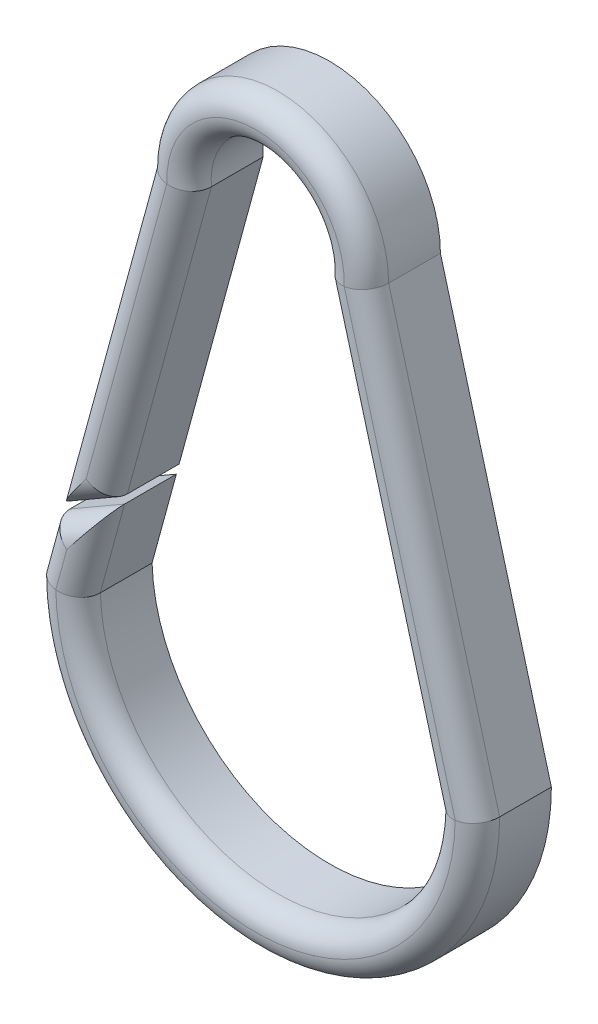
ISO-10303-21;
HEADER;
FILE_DESCRIPTION(('STEP AP214'),'2;1');
FILE_NAME('part.step','',(''),(''),'','','');
FILE_SCHEMA(('AUTOMOTIVE_DESIGN { 1 0 10303 214 1 1 1 1 }'));
ENDSEC;
DATA;
#1=APPLICATION_CONTEXT('core data for automotive mechanical design processes');
#2=APPLICATION_PROTOCOL_DEFINITION('international standard','automotive_design',2000,#1);
#3=PRODUCT_CONTEXT('',#1,'mechanical');
#4=PRODUCT('Part','Part','',(#3));
#5=PRODUCT_RELATED_PRODUCT_CATEGORY('part','',(#4));
#6=PRODUCT_DEFINITION_FORMATION('','',#4);
#7=PRODUCT_DEFINITION_CONTEXT('part definition',#1,'design');
#8=PRODUCT_DEFINITION('design','',#6,#7);
#9=PRODUCT_DEFINITION_SHAPE('','',#8);
#10=(LENGTH_UNIT() NAMED_UNIT(*) SI_UNIT(.MILLI.,.METRE.));
#11=(NAMED_UNIT(*) PLANE_ANGLE_UNIT() SI_UNIT($,.RADIAN.));
#12=(NAMED_UNIT(*) SI_UNIT($,.STERADIAN.) SOLID_ANGLE_UNIT());
#13=UNCERTAINTY_MEASURE_WITH_UNIT(LENGTH_MEASURE(1.E-05),#10,'distance_accuracy_value','');
#14=(GEOMETRIC_REPRESENTATION_CONTEXT(3) GLOBAL_UNCERTAINTY_ASSIGNED_CONTEXT((#13)) GLOBAL_UNIT_ASSIGNED_CONTEXT((#10,
#11,#12)) REPRESENTATION_CONTEXT('',''));
#15=CARTESIAN_POINT('',(0.,0.,0.));
#16=DIRECTION('',(0.,0.,1.));
#17=DIRECTION('',(1.,0.,0.));
#18=AXIS2_PLACEMENT_3D('',#15,#16,#17);
#19=CARTESIAN_POINT('',(0.0449745055544494,13.0306130568705,1.17399375005412));
#20=DIRECTION('',(0.,0.,1.));
#21=DIRECTION('',(1.,0.,0.));
#22=AXIS2_PLACEMENT_3D('',#19,#20,#21);
#23=PLANE('',#22);
#24=DIRECTION('',(-0.866025403784438,-0.500000000000001,0.));
#25=VECTOR('',#24,1.);
#26=CARTESIAN_POINT('',(-4.08002549444555,2.99711940781657,1.17399375005412));
#27=LINE('',#26,#25);
#28=CARTESIAN_POINT('',(-5.03739474479932,2.44438201341095,1.17399375005412));
#29=VERTEX_POINT('',#28);
#30=CARTESIAN_POINT('',(-6.88274704673623,1.37896736513798,1.17399375005412));
#31=VERTEX_POINT('',#30);
#32=EDGE_CURVE('E406',#29,#31,#27,.T.);
#33=ORIENTED_EDGE('',*,*,#32,.T.);
#34=DIRECTION('',(-0.263117405792109,-0.964763821237732,0.));
#35=VECTOR('',#34,1.);
#36=CARTESIAN_POINT('',(-3.70502549444555,13.0306130568705,1.17399375005412));
#37=LINE('',#36,#35);
#38=CARTESIAN_POINT('',(-3.70502549444555,13.0306130568705,1.17399375005412));
#39=VERTEX_POINT('',#38);
#40=EDGE_CURVE('E374',#39,#31,#37,.T.);
#41=ORIENTED_EDGE('',*,*,#40,.F.);
#42=CARTESIAN_POINT('',(0.0449745055544494,13.0306130568705,1.17399375005412));
#43=DIRECTION('',(0.,0.,1.));
#44=DIRECTION('',(1.,0.,0.));
#45=AXIS2_PLACEMENT_3D('',#42,#43,#44);
#46=CIRCLE('',#45,3.75);
#47=CARTESIAN_POINT('',(3.79497450555445,13.0306130568705,1.17399375005412));
#48=VERTEX_POINT('',#47);
#49=EDGE_CURVE('E174',#48,#39,#46,.T.);
#50=ORIENTED_EDGE('',*,*,#49,.F.);
#51=DIRECTION('',(-0.263117405792109,0.964763821237732,0.));
#52=VECTOR('',#51,1.);
#53=CARTESIAN_POINT('',(3.79497450555445,13.0306130568705,1.17399375005412));
#54=LINE('',#53,#52);
#55=CARTESIAN_POINT('',(7.54497450555445,-0.719386943129537,1.17399375005412));
#56=VERTEX_POINT('',#55);
#57=EDGE_CURVE('E380',#56,#48,#54,.T.);
#58=ORIENTED_EDGE('',*,*,#57,.F.);
#59=CARTESIAN_POINT('',(0.0449745055544511,-0.719386943129537,1.17399375005412));
#60=DIRECTION('',(0.,0.,1.));
#61=DIRECTION('',(1.,0.,0.));
#62=AXIS2_PLACEMENT_3D('',#59,#60,#61);
#63=CIRCLE('',#62,7.5);
#64=CARTESIAN_POINT('',(-7.45502549444555,-0.719386943129538,1.17399375005412));
#65=VERTEX_POINT('',#64);
#66=EDGE_CURVE('E377',#65,#56,#63,.T.);
#67=ORIENTED_EDGE('',*,*,#66,.F.);
#68=CARTESIAN_POINT('',(-6.97619009285173,1.03634286271448,1.17399375005412));
#69=VERTEX_POINT('',#68);
#70=EDGE_CURVE('E373',#69,#65,#37,.T.);
#71=ORIENTED_EDGE('',*,*,#70,.F.);
#72=DIRECTION('',(0.866025403784438,0.500000000000001,0.));
#73=VECTOR('',#72,1.);
#74=CARTESIAN_POINT('',(-3.95502549444555,2.78061305687046,1.17399375005412));
#75=LINE('',#74,#73);
#76=CARTESIAN_POINT('',(-5.13083779091482,2.10175751098745,1.17399375005412));
#77=VERTEX_POINT('',#76);
#78=EDGE_CURVE('E92',#69,#77,#75,.T.);
#79=ORIENTED_EDGE('',*,*,#78,.T.);
#80=DIRECTION('',(-0.263117405792109,-0.964763821237732,0.));
#81=VECTOR('',#80,1.);
#82=CARTESIAN_POINT('',(-2.19815581256686,12.85492476493,1.17399375005412));
#83=LINE('',#82,#81);
#84=CARTESIAN_POINT('',(-5.95202083875399,-0.909246997756191,1.17399375005412));
#85=VERTEX_POINT('',#84);
#86=EDGE_CURVE('E574',#77,#85,#83,.T.);
#87=ORIENTED_EDGE('',*,*,#86,.T.);
#88=CARTESIAN_POINT('',(0.0449745055544511,-0.719386943129537,1.17399375005412));
#89=DIRECTION('',(0.,0.,1.));
#90=DIRECTION('',(1.,0.,0.));
#91=AXIS2_PLACEMENT_3D('',#88,#89,#90);
#92=CIRCLE('',#91,6.);
#93=CARTESIAN_POINT('',(6.0419698498629,-0.909246997756193,1.17399375005412));
#94=VERTEX_POINT('',#93);
#95=EDGE_CURVE('E576',#85,#94,#92,.T.);
#96=ORIENTED_EDGE('',*,*,#95,.T.);
#97=DIRECTION('',(-0.263117405792109,0.964763821237732,0.));
#98=VECTOR('',#97,1.);
#99=CARTESIAN_POINT('',(2.28810482367576,12.85492476493,1.17399375005412));
#100=LINE('',#99,#98);
#101=CARTESIAN_POINT('',(2.28810482367576,12.85492476493,1.17399375005412));
#102=VERTEX_POINT('',#101);
#103=EDGE_CURVE('E362',#94,#102,#100,.T.);
#104=ORIENTED_EDGE('',*,*,#103,.T.);
#105=CARTESIAN_POINT('',(0.0449745055544494,13.0306130568705,1.17399375005412));
#106=DIRECTION('',(0.,0.,1.));
#107=DIRECTION('',(1.,0.,0.));
#108=AXIS2_PLACEMENT_3D('',#105,#106,#107);
#109=CIRCLE('',#108,2.25);
#110=CARTESIAN_POINT('',(-2.19815581256686,12.85492476493,1.17399375005412));
#111=VERTEX_POINT('',#110);
#112=EDGE_CURVE('E572',#102,#111,#109,.T.);
#113=ORIENTED_EDGE('',*,*,#112,.T.);
#114=EDGE_CURVE('E172',#111,#29,#83,.T.);
#115=ORIENTED_EDGE('',*,*,#114,.T.);
#116=EDGE_LOOP('',(#33,#41,#50,#58,#67,#71,#79,#87,#96,#104,#113,#115));
#117=FACE_BOUND('',#116,.T.);
#118=ADVANCED_FACE('F37',(#117),#23,.F.);
#119=CARTESIAN_POINT('',(-3.70502549444555,13.0306130568705,3.67399375005412));
#120=DIRECTION('',(0.964763821237732,-0.263117405792109,0.));
#121=DIRECTION('',(0.263117405792109,0.964763821237732,0.));
#122=AXIS2_PLACEMENT_3D('',#119,#120,#121);
#123=PLANE('',#122);
#124=DIRECTION('',(0.,0.,-1.));
#125=VECTOR('',#124,1.);
#126=CARTESIAN_POINT('',(-6.88274704673623,1.37896736513798,3.67399375005412));
#127=LINE('',#126,#125);
#128=CARTESIAN_POINT('',(-6.88274704673623,1.37896736513798,2.92399375005412));
#129=VERTEX_POINT('',#128);
#130=EDGE_CURVE('E407',#129,#31,#127,.T.);
#131=ORIENTED_EDGE('',*,*,#130,.F.);
#132=DIRECTION('',(-0.263117405792109,-0.964763821237732,0.));
#133=VECTOR('',#132,1.);
#134=CARTESIAN_POINT('',(-3.70502549444555,13.0306130568705,2.92399375005412));
#135=LINE('',#134,#133);
#136=CARTESIAN_POINT('',(-3.70502549444555,13.0306130568705,2.92399375005412));
#137=VERTEX_POINT('',#136);
#138=EDGE_CURVE('E11',#129,#137,#135,.F.);
#139=ORIENTED_EDGE('',*,*,#138,.T.);
#140=DIRECTION('',(0.,0.,-1.));
#141=VECTOR('',#140,1.);
#142=CARTESIAN_POINT('',(-3.70502549444555,13.0306130568705,3.67399375005412));
#143=LINE('',#142,#141);
#144=EDGE_CURVE('E389',#137,#39,#143,.T.);
#145=ORIENTED_EDGE('',*,*,#144,.T.);
#146=ORIENTED_EDGE('',*,*,#40,.T.);
#147=EDGE_LOOP('',(#131,#139,#145,#146));
#148=FACE_BOUND('',#147,.T.);
#149=ADVANCED_FACE('F271',(#148),#123,.F.);
#150=DIRECTION('',(0.,0.,-1.));
#151=VECTOR('',#150,1.);
#152=CARTESIAN_POINT('',(-7.45502549444555,-0.719386943129538,3.67399375005412));
#153=LINE('',#152,#151);
#154=CARTESIAN_POINT('',(-7.45502549444555,-0.719386943129538,2.92399375005412));
#155=VERTEX_POINT('',#154);
#156=EDGE_CURVE('E387',#155,#65,#153,.T.);
#157=ORIENTED_EDGE('',*,*,#156,.F.);
#158=DIRECTION('',(-0.263117405792109,-0.964763821237732,0.));
#159=VECTOR('',#158,1.);
#160=CARTESIAN_POINT('',(-6.97619009285173,1.03634286271448,2.92399375005412));
#161=LINE('',#160,#159);
#162=CARTESIAN_POINT('',(-6.97619009285172,1.03634286271448,2.92399375005412));
#163=VERTEX_POINT('',#162);
#164=EDGE_CURVE('E342',#155,#163,#161,.F.);
#165=ORIENTED_EDGE('',*,*,#164,.T.);
#166=DIRECTION('',(0.,0.,1.));
#167=VECTOR('',#166,1.);
#168=CARTESIAN_POINT('',(-6.97619009285172,1.03634286271448,3.67399375005412));
#169=LINE('',#168,#167);
#170=EDGE_CURVE('E567',#69,#163,#169,.T.);
#171=ORIENTED_EDGE('',*,*,#170,.F.);
#172=ORIENTED_EDGE('',*,*,#70,.T.);
#173=EDGE_LOOP('',(#157,#165,#171,#172));
#174=FACE_BOUND('',#173,.T.);
#175=ADVANCED_FACE('F277',(#174),#123,.F.);
#176=CARTESIAN_POINT('',(-2.19815581256686,12.85492476493,3.67399375005412));
#177=DIRECTION('',(0.964763821237732,-0.263117405792109,0.));
#178=DIRECTION('',(0.263117405792109,0.964763821237732,0.));
#179=AXIS2_PLACEMENT_3D('',#176,#177,#178);
#180=PLANE('',#179);
#181=DIRECTION('',(0.,0.,-1.));
#182=VECTOR('',#181,1.);
#183=CARTESIAN_POINT('',(-2.19815581256686,12.85492476493,3.67399375005412));
#184=LINE('',#183,#182);
#185=CARTESIAN_POINT('',(-2.19815581256686,12.85492476493,2.92399375005412));
#186=VERTEX_POINT('',#185);
#187=EDGE_CURVE('E158',#186,#111,#184,.T.);
#188=ORIENTED_EDGE('',*,*,#187,.F.);
#189=DIRECTION('',(-0.263117405792109,-0.964763821237732,0.));
#190=VECTOR('',#189,1.);
#191=CARTESIAN_POINT('',(-2.19815581256686,12.85492476493,2.92399375005412));
#192=LINE('',#191,#190);
#193=CARTESIAN_POINT('',(-5.03739474479932,2.44438201341095,2.92399375005412));
#194=VERTEX_POINT('',#193);
#195=EDGE_CURVE('E165',#186,#194,#192,.T.);
#196=ORIENTED_EDGE('',*,*,#195,.T.);
#197=DIRECTION('',(0.,0.,-1.));
#198=VECTOR('',#197,1.);
#199=CARTESIAN_POINT('',(-5.03739474479932,2.44438201341095,3.67399375005412));
#200=LINE('',#199,#198);
#201=EDGE_CURVE('E394',#194,#29,#200,.T.);
#202=ORIENTED_EDGE('',*,*,#201,.T.);
#203=ORIENTED_EDGE('',*,*,#114,.F.);
#204=EDGE_LOOP('',(#188,#196,#202,#203));
#205=FACE_BOUND('',#204,.T.);
#206=ADVANCED_FACE('F170',(#205),#180,.T.);
#207=DIRECTION('',(0.,0.,1.));
#208=VECTOR('',#207,1.);
#209=CARTESIAN_POINT('',(-5.13083779091482,2.10175751098746,3.67399375005412));
#210=LINE('',#209,#208);
#211=CARTESIAN_POINT('',(-5.13083779091482,2.10175751098746,2.92399375005412));
#212=VERTEX_POINT('',#211);
#213=EDGE_CURVE('E391',#77,#212,#210,.T.);
#214=ORIENTED_EDGE('',*,*,#213,.T.);
#215=DIRECTION('',(-0.263117405792109,-0.964763821237732,0.));
#216=VECTOR('',#215,1.);
#217=CARTESIAN_POINT('',(-2.19815581256686,12.85492476493,2.92399375005412));
#218=LINE('',#217,#216);
#219=CARTESIAN_POINT('',(-5.95202083875399,-0.909246997756191,2.92399375005412));
#220=VERTEX_POINT('',#219);
#221=EDGE_CURVE('E352',#212,#220,#218,.T.);
#222=ORIENTED_EDGE('',*,*,#221,.T.);
#223=DIRECTION('',(0.,0.,-1.));
#224=VECTOR('',#223,1.);
#225=CARTESIAN_POINT('',(-5.95202083875399,-0.909246997756191,3.67399375005412));
#226=LINE('',#225,#224);
#227=EDGE_CURVE('E175',#220,#85,#226,.T.);
#228=ORIENTED_EDGE('',*,*,#227,.T.);
#229=ORIENTED_EDGE('',*,*,#86,.F.);
#230=EDGE_LOOP('',(#214,#222,#228,#229));
#231=FACE_BOUND('',#230,.T.);
#232=ADVANCED_FACE('F295',(#231),#180,.T.);
#233=CARTESIAN_POINT('',(0.0449745055544494,13.0306130568705,3.67399375005412));
#234=DIRECTION('',(0.,0.,-1.));
#235=DIRECTION('',(-1.,0.,0.));
#236=AXIS2_PLACEMENT_3D('',#233,#234,#235);
#237=CYLINDRICAL_SURFACE('',#236,3.75);
#238=ORIENTED_EDGE('',*,*,#144,.F.);
#239=CARTESIAN_POINT('',(0.0449745055544494,13.0306130568705,2.92399375005412));
#240=DIRECTION('',(0.,0.,1.));
#241=DIRECTION('',(1.,0.,0.));
#242=AXIS2_PLACEMENT_3D('',#239,#240,#241);
#243=CIRCLE('',#242,3.75);
#244=CARTESIAN_POINT('',(3.79497450555445,13.0306130568705,2.92399375005412));
#245=VERTEX_POINT('',#244);
#246=EDGE_CURVE('E347',#137,#245,#243,.F.);
#247=ORIENTED_EDGE('',*,*,#246,.T.);
#248=DIRECTION('',(0.,0.,-1.));
#249=VECTOR('',#248,1.);
#250=CARTESIAN_POINT('',(3.79497450555445,13.0306130568705,3.67399375005412));
#251=LINE('',#250,#249);
#252=EDGE_CURVE('E383',#245,#48,#251,.T.);
#253=ORIENTED_EDGE('',*,*,#252,.T.);
#254=ORIENTED_EDGE('',*,*,#49,.T.);
#255=EDGE_LOOP('',(#238,#247,#253,#254));
#256=FACE_BOUND('',#255,.T.);
#257=ADVANCED_FACE('F290',(#256),#237,.T.);
#258=CARTESIAN_POINT('',(0.0449745055544511,-0.719386943129537,3.67399375005412));
#259=DIRECTION('',(0.,0.,-1.));
#260=DIRECTION('',(-1.,0.,0.));
#261=AXIS2_PLACEMENT_3D('',#258,#259,#260);
#262=CYLINDRICAL_SURFACE('',#261,7.5);
#263=DIRECTION('',(0.,0.,-1.));
#264=VECTOR('',#263,1.);
#265=CARTESIAN_POINT('',(7.54497450555445,-0.719386943129537,3.67399375005412));
#266=LINE('',#265,#264);
#267=CARTESIAN_POINT('',(7.54497450555445,-0.719386943129537,2.92399375005412));
#268=VERTEX_POINT('',#267);
#269=EDGE_CURVE('E385',#268,#56,#266,.T.);
#270=ORIENTED_EDGE('',*,*,#269,.F.);
#271=CARTESIAN_POINT('',(0.0449745055544511,-0.719386943129537,2.92399375005412));
#272=DIRECTION('',(0.,0.,1.));
#273=DIRECTION('',(1.,0.,0.));
#274=AXIS2_PLACEMENT_3D('',#271,#272,#273);
#275=CIRCLE('',#274,7.5);
#276=EDGE_CURVE('E338',#268,#155,#275,.F.);
#277=ORIENTED_EDGE('',*,*,#276,.T.);
#278=ORIENTED_EDGE('',*,*,#156,.T.);
#279=ORIENTED_EDGE('',*,*,#66,.T.);
#280=EDGE_LOOP('',(#270,#277,#278,#279));
#281=FACE_BOUND('',#280,.T.);
#282=ADVANCED_FACE('F287',(#281),#262,.T.);
#283=CARTESIAN_POINT('',(3.79497450555445,13.0306130568705,3.67399375005412));
#284=DIRECTION('',(-0.964763821237732,-0.263117405792109,0.));
#285=DIRECTION('',(0.263117405792109,-0.964763821237732,0.));
#286=AXIS2_PLACEMENT_3D('',#283,#284,#285);
#287=PLANE('',#286);
#288=ORIENTED_EDGE('',*,*,#252,.F.);
#289=DIRECTION('',(-0.263117405792109,0.964763821237732,0.));
#290=VECTOR('',#289,1.);
#291=CARTESIAN_POINT('',(7.54497450555445,-0.719386943129537,2.92399375005412));
#292=LINE('',#291,#290);
#293=EDGE_CURVE('E343',#245,#268,#292,.F.);
#294=ORIENTED_EDGE('',*,*,#293,.T.);
#295=ORIENTED_EDGE('',*,*,#269,.T.);
#296=ORIENTED_EDGE('',*,*,#57,.T.);
#297=EDGE_LOOP('',(#288,#294,#295,#296));
#298=FACE_BOUND('',#297,.T.);
#299=ADVANCED_FACE('F284',(#298),#287,.F.);
#300=CARTESIAN_POINT('',(0.0449745055544494,13.0306130568705,3.67399375005412));
#301=DIRECTION('',(0.,0.,-1.));
#302=DIRECTION('',(-1.,0.,0.));
#303=AXIS2_PLACEMENT_3D('',#300,#301,#302);
#304=CYLINDRICAL_SURFACE('',#303,2.25);
#305=DIRECTION('',(0.,0.,-1.));
#306=VECTOR('',#305,1.);
#307=CARTESIAN_POINT('',(2.28810482367576,12.85492476493,3.67399375005412));
#308=LINE('',#307,#306);
#309=CARTESIAN_POINT('',(2.28810482367576,12.85492476493,2.92399375005412));
#310=VERTEX_POINT('',#309);
#311=EDGE_CURVE('E160',#310,#102,#308,.T.);
#312=ORIENTED_EDGE('',*,*,#311,.F.);
#313=CARTESIAN_POINT('',(0.0449745055544494,13.0306130568705,2.92399375005412));
#314=DIRECTION('',(0.,0.,1.));
#315=DIRECTION('',(1.,0.,0.));
#316=AXIS2_PLACEMENT_3D('',#313,#314,#315);
#317=CIRCLE('',#316,2.25);
#318=EDGE_CURVE('E154',#310,#186,#317,.T.);
#319=ORIENTED_EDGE('',*,*,#318,.T.);
#320=ORIENTED_EDGE('',*,*,#187,.T.);
#321=ORIENTED_EDGE('',*,*,#112,.F.);
#322=EDGE_LOOP('',(#312,#319,#320,#321));
#323=FACE_BOUND('',#322,.T.);
#324=ADVANCED_FACE('F156',(#323),#304,.F.);
#325=CARTESIAN_POINT('',(0.0449745055544511,-0.719386943129537,3.67399375005412));
#326=DIRECTION('',(0.,0.,-1.));
#327=DIRECTION('',(-1.,0.,0.));
#328=AXIS2_PLACEMENT_3D('',#325,#326,#327);
#329=CYLINDRICAL_SURFACE('',#328,6.);
#330=ORIENTED_EDGE('',*,*,#227,.F.);
#331=CARTESIAN_POINT('',(0.0449745055544511,-0.719386943129537,2.92399375005412));
#332=DIRECTION('',(0.,0.,1.));
#333=DIRECTION('',(1.,0.,0.));
#334=AXIS2_PLACEMENT_3D('',#331,#332,#333);
#335=CIRCLE('',#334,6.);
#336=CARTESIAN_POINT('',(6.0419698498629,-0.909246997756193,2.92399375005412));
#337=VERTEX_POINT('',#336);
#338=EDGE_CURVE('E354',#220,#337,#335,.T.);
#339=ORIENTED_EDGE('',*,*,#338,.T.);
#340=DIRECTION('',(0.,0.,-1.));
#341=VECTOR('',#340,1.);
#342=CARTESIAN_POINT('',(6.0419698498629,-0.909246997756193,3.67399375005412));
#343=LINE('',#342,#341);
#344=EDGE_CURVE('E360',#337,#94,#343,.T.);
#345=ORIENTED_EDGE('',*,*,#344,.T.);
#346=ORIENTED_EDGE('',*,*,#95,.F.);
#347=EDGE_LOOP('',(#330,#339,#345,#346));
#348=FACE_BOUND('',#347,.T.);
#349=ADVANCED_FACE('F491',(#348),#329,.F.);
#350=CARTESIAN_POINT('',(2.28810482367576,12.85492476493,3.67399375005412));
#351=DIRECTION('',(-0.964763821237732,-0.263117405792109,0.));
#352=DIRECTION('',(0.263117405792109,-0.964763821237732,0.));
#353=AXIS2_PLACEMENT_3D('',#350,#351,#352);
#354=PLANE('',#353);
#355=ORIENTED_EDGE('',*,*,#344,.F.);
#356=DIRECTION('',(-0.263117405792109,0.964763821237732,0.));
#357=VECTOR('',#356,1.);
#358=CARTESIAN_POINT('',(2.28810482367576,12.85492476493,2.92399375005412));
#359=LINE('',#358,#357);
#360=EDGE_CURVE('E166',#337,#310,#359,.T.);
#361=ORIENTED_EDGE('',*,*,#360,.T.);
#362=ORIENTED_EDGE('',*,*,#311,.T.);
#363=ORIENTED_EDGE('',*,*,#103,.F.);
#364=EDGE_LOOP('',(#355,#361,#362,#363));
#365=FACE_BOUND('',#364,.T.);
#366=ADVANCED_FACE('F358',(#365),#354,.T.);
#367=CARTESIAN_POINT('',(-3.95502549444555,2.78061305687046,3.67399375005412));
#368=DIRECTION('',(-0.500000000000001,0.866025403784438,0.));
#369=DIRECTION('',(-0.866025403784438,-0.500000000000001,0.));
#370=AXIS2_PLACEMENT_3D('',#367,#368,#369);
#371=PLANE('',#370);
#372=ORIENTED_EDGE('',*,*,#170,.T.);
#373=DIRECTION('',(0.866025403784438,0.500000000000001,0.));
#374=VECTOR('',#373,1.);
#375=CARTESIAN_POINT('',(-3.95502549444555,2.78061305687046,2.92399375005412));
#376=LINE('',#375,#374);
#377=EDGE_CURVE('E345',#163,#212,#376,.T.);
#378=ORIENTED_EDGE('',*,*,#377,.T.);
#379=ORIENTED_EDGE('',*,*,#213,.F.);
#380=ORIENTED_EDGE('',*,*,#78,.F.);
#381=EDGE_LOOP('',(#372,#378,#379,#380));
#382=FACE_BOUND('',#381,.T.);
#383=ADVANCED_FACE('F473',(#382),#371,.T.);
#384=CARTESIAN_POINT('',(-4.08002549444555,2.99711940781657,3.67399375005412));
#385=DIRECTION('',(0.500000000000001,-0.866025403784438,0.));
#386=DIRECTION('',(0.866025403784438,0.500000000000001,0.));
#387=AXIS2_PLACEMENT_3D('',#384,#385,#386);
#388=PLANE('',#387);
#389=ORIENTED_EDGE('',*,*,#201,.F.);
#390=DIRECTION('',(-0.866025403784438,-0.500000000000001,0.));
#391=VECTOR('',#390,1.);
#392=CARTESIAN_POINT('',(-4.08002549444555,2.99711940781657,2.92399375005412));
#393=LINE('',#392,#391);
#394=EDGE_CURVE('E47',#194,#129,#393,.T.);
#395=ORIENTED_EDGE('',*,*,#394,.T.);
#396=ORIENTED_EDGE('',*,*,#130,.T.);
#397=ORIENTED_EDGE('',*,*,#32,.F.);
#398=EDGE_LOOP('',(#389,#395,#396,#397));
#399=FACE_BOUND('',#398,.T.);
#400=ADVANCED_FACE('F268',(#399),#388,.T.);
#401=CARTESIAN_POINT('',(-3.58002549444555,2.13109400403213,2.92399375005412));
#402=DIRECTION('',(0.866025403784438,0.500000000000001,0.));
#403=DIRECTION('',(-0.500000000000001,0.866025403784438,0.));
#404=AXIS2_PLACEMENT_3D('',#401,#402,#403);
#405=CYLINDRICAL_SURFACE('',#404,0.75);
#406=CARTESIAN_POINT('',(-6.33384308022977,0.541176679580487,2.92399375005412));
#407=DIRECTION('',(0.791996071020887,-0.610526185750848,0.));
#408=DIRECTION('',(-0.610526185750848,-0.791996071020887,0.));
#409=AXIS2_PLACEMENT_3D('',#406,#407,#408);
#410=ELLIPSE('',#409,1.97044011770838,0.75);
#411=CARTESIAN_POINT('',(-6.33384308022977,0.541176679580485,3.67399375005412));
#412=VERTEX_POINT('',#411);
#413=EDGE_CURVE('E41',#212,#412,#410,.T.);
#414=ORIENTED_EDGE('',*,*,#413,.F.);
#415=ORIENTED_EDGE('',*,*,#377,.F.);
#416=CARTESIAN_POINT('',(-6.33384308022977,0.541176679580486,2.92399375005412));
#417=DIRECTION('',(0.610526185750848,0.791996071020887,0.));
#418=DIRECTION('',(0.791996071020887,-0.610526185750848,0.));
#419=AXIS2_PLACEMENT_3D('',#416,#417,#418);
#420=ELLIPSE('',#419,0.811048231330201,0.75);
#421=EDGE_CURVE('E564',#412,#163,#420,.F.);
#422=ORIENTED_EDGE('',*,*,#421,.F.);
#423=EDGE_LOOP('',(#414,#415,#422));
#424=FACE_BOUND('',#423,.T.);
#425=ADVANCED_FACE('F39',(#424),#405,.T.);
#426=CARTESIAN_POINT('',(-2.92172867849516,13.052262819274,2.92399375005412));
#427=DIRECTION('',(-0.263117405792109,-0.964763821237732,0.));
#428=DIRECTION('',(0.964763821237732,-0.263117405792109,0.));
#429=AXIS2_PLACEMENT_3D('',#426,#427,#428);
#430=CYLINDRICAL_SURFACE('',#429,0.75);
#431=ORIENTED_EDGE('',*,*,#221,.F.);
#432=ORIENTED_EDGE('',*,*,#413,.T.);
#433=DIRECTION('',(-0.263117405792109,-0.964763821237732,0.));
#434=VECTOR('',#433,1.);
#435=CARTESIAN_POINT('',(-2.72183724390187,13.7851980794495,3.67399375005412));
#436=LINE('',#435,#434);
#437=CARTESIAN_POINT('',(-6.70431639228877,-0.817225464636649,3.67399375005412));
#438=VERTEX_POINT('',#437);
#439=EDGE_CURVE('E79',#438,#412,#436,.F.);
#440=ORIENTED_EDGE('',*,*,#439,.F.);
#441=CARTESIAN_POINT('',(-5.95202083875399,-0.909246997756191,2.92399375005412));
#442=CARTESIAN_POINT('',(-5.9519830972798,-0.909250525608945,2.96585428924864));
#443=CARTESIAN_POINT('',(-5.95553800367445,-0.908832515406309,3.00770119596999));
#444=CARTESIAN_POINT('',(-5.96955154002166,-0.907179745986317,3.0901630083232));
#445=CARTESIAN_POINT('',(-5.98000293547133,-0.905945842648211,3.13077915838586));
#446=CARTESIAN_POINT('',(-6.00753392543013,-0.902686925508698,3.20968151459674));
#447=CARTESIAN_POINT('',(-6.02461591268308,-0.900661626118949,3.24796687386954));
#448=CARTESIAN_POINT('',(-6.06488164160473,-0.895870003645837,3.32112074893146));
#449=CARTESIAN_POINT('',(-6.08806454978478,-0.893103781784054,3.35598973056307));
#450=CARTESIAN_POINT('',(-6.13998626914066,-0.886881052193322,3.4215261343208));
#451=CARTESIAN_POINT('',(-6.16875224521049,-0.883421166552616,3.45217170687668));
#452=CARTESIAN_POINT('',(-6.23094223890964,-0.875903630751185,3.50823374530939));
#453=CARTESIAN_POINT('',(-6.26436780358085,-0.871845782033567,3.53364846750953));
#454=CARTESIAN_POINT('',(-6.33529215130453,-0.863189218408831,3.57879904428131));
#455=CARTESIAN_POINT('',(-6.37283020737129,-0.858585246185789,3.59847211948851));
#456=CARTESIAN_POINT('',(-6.45061475493056,-0.848991285389381,3.63124163928745));
#457=CARTESIAN_POINT('',(-6.4908594499743,-0.84400155253028,3.64434239814213));
#458=CARTESIAN_POINT('',(-6.55895110943689,-0.835511812841434,3.66035781130407));
#459=CARTESIAN_POINT('',(-6.58636710716386,-0.832081337695731,3.66522077076219));
#460=CARTESIAN_POINT('',(-6.64153103983908,-0.825153873326359,3.6718838676268));
#461=CARTESIAN_POINT('',(-6.66927834087835,-0.821657005321561,3.67368912876935));
#462=CARTESIAN_POINT('',(-6.69945009193958,-0.817841189450489,3.67398198300345));
#463=CARTESIAN_POINT('',(-6.70188334285505,-0.817533361779162,3.67399378096689));
#464=CARTESIAN_POINT('',(-6.70431639228877,-0.817225464635882,3.67399375005412));
#465=B_SPLINE_CURVE_WITH_KNOTS('',3,(#441,#442,#443,#444,#445,#446,#447,#448,#449,#450,#451,
#452,#453,#454,#455,#456,#457,#458,#459,#460,#461,#462,#463,#464),.UNSPECIFIED.,.F.,.F.,(4,2,2,
2,2,2,2,2,2,2,2,4),(0.,0.125408778092763,0.250686209510829,0.376008891172538,0.501314460523631,
0.627245732861154,0.753218915985328,0.880521898322377,1.00774120551205,1.09175777816457,
1.17563342580017,1.18299131185041),.UNSPECIFIED.);
#466=EDGE_CURVE('E249',#220,#438,#465,.T.);
#467=ORIENTED_EDGE('',*,*,#466,.F.);
#468=EDGE_LOOP('',(#431,#432,#440,#467));
#469=FACE_BOUND('',#468,.T.);
#470=ADVANCED_FACE('F260',(#469),#430,.T.);
#471=CARTESIAN_POINT('',(-2.72183724390187,13.7851980794495,2.92399375005412));
#472=DIRECTION('',(0.263117405792109,0.964763821237732,0.));
#473=DIRECTION('',(-0.964763821237732,0.263117405792109,0.));
#474=AXIS2_PLACEMENT_3D('',#471,#472,#473);
#475=CYLINDRICAL_SURFACE('',#474,0.75);
#476=ORIENTED_EDGE('',*,*,#421,.T.);
#477=ORIENTED_EDGE('',*,*,#164,.F.);
#478=CARTESIAN_POINT('',(-7.45502549444555,-0.719386943129538,2.92399375005412));
#479=CARTESIAN_POINT('',(-7.4550623974213,-0.719381323614066,2.96591171301624));
#480=CARTESIAN_POINT('',(-7.45151354226274,-0.71985724493192,3.00781686384974));
#481=CARTESIAN_POINT('',(-7.43751863448322,-0.721730436452894,3.09039832354614));
#482=CARTESIAN_POINT('',(-7.42707923862804,-0.723126817423009,3.13107577883024));
#483=CARTESIAN_POINT('',(-7.39957119711314,-0.726800064559524,3.21009951270098));
#484=CARTESIAN_POINT('',(-7.38249994779006,-0.729077276538353,3.24844486885953));
#485=CARTESIAN_POINT('',(-7.34224577753641,-0.734433842837376,3.32170843333515));
#486=CARTESIAN_POINT('',(-7.31906385539646,-0.737513066067702,3.35662720045004));
#487=CARTESIAN_POINT('',(-7.26715989970977,-0.744386332373706,3.42220325037839));
#488=CARTESIAN_POINT('',(-7.23841754130553,-0.748182996665434,3.45284416655047));
#489=CARTESIAN_POINT('',(-7.17626555649775,-0.756362856183783,3.50888238619596));
#490=CARTESIAN_POINT('',(-7.14285440802105,-0.760746242668111,3.53427797292066));
#491=CARTESIAN_POINT('',(-7.07201630244763,-0.770001132505002,3.57932769621879));
#492=CARTESIAN_POINT('',(-7.03455712249629,-0.774876528415442,3.59893029422799));
#493=CARTESIAN_POINT('',(-6.95693079125266,-0.784932643101101,3.63156433136764));
#494=CARTESIAN_POINT('',(-6.91676545940358,-0.790113156445771,3.64460013657904));
#495=CARTESIAN_POINT('',(-6.84890630559536,-0.798821902155313,3.66049351288116));
#496=CARTESIAN_POINT('',(-6.82164654429451,-0.802309102142645,3.66530743933594));
#497=CARTESIAN_POINT('',(-6.76679419534154,-0.809302332250159,3.67190346039471));
#498=CARTESIAN_POINT('',(-6.73920223780792,-0.812808321322663,3.67369059244712));
#499=CARTESIAN_POINT('',(-6.70918266984569,-0.816609555257206,3.67398198285648));
#500=CARTESIAN_POINT('',(-6.70674944237144,-0.816917568639661,3.67399378082284));
#501=CARTESIAN_POINT('',(-6.70431639228878,-0.817225464635887,3.67399375005412));
#502=B_SPLINE_CURVE_WITH_KNOTS('',3,(#478,#479,#480,#481,#482,#483,#484,#485,#486,#487,#488,
#489,#490,#491,#492,#493,#494,#495,#496,#497,#498,#499,#500,#501),.UNSPECIFIED.,.F.,.F.,(4,2,2,
2,2,2,2,2,2,2,2,4),(0.,0.125582480432083,0.251043816235328,0.376554457974871,0.502044597683502,
0.628002412756871,0.754001387582028,0.881089741020052,1.00809348499334,1.09164993687078,
1.17506718985335,1.18242507590724),.UNSPECIFIED.);
#503=EDGE_CURVE('E255',#438,#155,#502,.F.);
#504=ORIENTED_EDGE('',*,*,#503,.F.);
#505=ORIENTED_EDGE('',*,*,#439,.T.);
#506=EDGE_LOOP('',(#476,#477,#504,#505));
#507=FACE_BOUND('',#506,.T.);
#508=ADVANCED_FACE('F243',(#507),#475,.T.);
#509=CARTESIAN_POINT('',(0.0449745055544511,-0.719386943129537,2.92399375005412));
#510=DIRECTION('',(0.,0.,1.));
#511=DIRECTION('',(1.,0.,0.));
#512=AXIS2_PLACEMENT_3D('',#509,#510,#511);
#513=TOROIDAL_SURFACE('',#512,6.75,0.75);
#514=ORIENTED_EDGE('',*,*,#338,.F.);
#515=ORIENTED_EDGE('',*,*,#466,.T.);
#516=CARTESIAN_POINT('',(0.0449745055544511,-0.719386943129537,3.67399375005412));
#517=DIRECTION('',(0.,0.,1.));
#518=DIRECTION('',(1.,0.,0.));
#519=AXIS2_PLACEMENT_3D('',#516,#517,#518);
#520=CIRCLE('',#519,6.75);
#521=CARTESIAN_POINT('',(6.79426540339789,-0.817225464636651,3.67399375005412));
#522=VERTEX_POINT('',#521);
#523=EDGE_CURVE('E236',#522,#438,#520,.F.);
#524=ORIENTED_EDGE('',*,*,#523,.F.);
#525=CARTESIAN_POINT('',(6.0419698498629,-0.909246997756193,2.92399375005412));
#526=CARTESIAN_POINT('',(6.0419321083887,-0.909250525608947,2.96585428924864));
#527=CARTESIAN_POINT('',(6.04548701478335,-0.908832515406311,3.00770119596999));
#528=CARTESIAN_POINT('',(6.05950055113056,-0.907179745986319,3.0901630083232));
#529=CARTESIAN_POINT('',(6.06995194658023,-0.905945842648213,3.13077915838586));
#530=CARTESIAN_POINT('',(6.09748293653903,-0.902686925508698,3.20968151459674));
#531=CARTESIAN_POINT('',(6.11456492379198,-0.900661626118949,3.24796687386954));
#532=CARTESIAN_POINT('',(6.15483065271363,-0.895870003645836,3.32112074893146));
#533=CARTESIAN_POINT('',(6.17801356089368,-0.893103781784055,3.35598973056307));
#534=CARTESIAN_POINT('',(6.22993528024956,-0.886881052193323,3.4215261343208));
#535=CARTESIAN_POINT('',(6.25870125631939,-0.883421166552616,3.45217170687668));
#536=CARTESIAN_POINT('',(6.32089125001854,-0.875903630751186,3.50823374530939));
#537=CARTESIAN_POINT('',(6.35431681468975,-0.871845782033569,3.53364846750953));
#538=CARTESIAN_POINT('',(6.42524116241344,-0.863189218408835,3.57879904428131));
#539=CARTESIAN_POINT('',(6.46277921848019,-0.858585246185794,3.59847211948851));
#540=CARTESIAN_POINT('',(6.54056376603946,-0.848991285389379,3.63124163928745));
#541=CARTESIAN_POINT('',(6.5808084610832,-0.844001552530272,3.64434239814213));
#542=CARTESIAN_POINT('',(6.64890012054579,-0.835511812841439,3.66035781130407));
#543=CARTESIAN_POINT('',(6.67631611827277,-0.832081337695747,3.66522077076219));
#544=CARTESIAN_POINT('',(6.73148005094798,-0.825153873326342,3.6718838676268));
#545=CARTESIAN_POINT('',(6.75922735198725,-0.821657005321501,3.67368912876935));
#546=CARTESIAN_POINT('',(6.78939910304848,-0.817841189450477,3.67398198300345));
#547=CARTESIAN_POINT('',(6.79183235396396,-0.817533361779155,3.67399378096689));
#548=CARTESIAN_POINT('',(6.79426540339768,-0.817225464635881,3.67399375005412));
#549=B_SPLINE_CURVE_WITH_KNOTS('',3,(#525,#526,#527,#528,#529,#530,#531,#532,#533,#534,#535,
#536,#537,#538,#539,#540,#541,#542,#543,#544,#545,#546,#547,#548),.UNSPECIFIED.,.F.,.F.,(4,2,2,
2,2,2,2,2,2,2,2,4),(0.,0.125408778092762,0.250686209510829,0.376008891172537,0.50131446052363,
0.627245732861154,0.753218915985328,0.880521898322377,1.00774120551205,1.09175777816458,
1.17563342580018,1.18299131185042),.UNSPECIFIED.);
#550=EDGE_CURVE('E227',#337,#522,#549,.T.);
#551=ORIENTED_EDGE('',*,*,#550,.F.);
#552=EDGE_LOOP('',(#514,#515,#524,#551));
#553=FACE_BOUND('',#552,.T.);
#554=ADVANCED_FACE('F239',(#553),#513,.T.);
#555=CARTESIAN_POINT('',(0.0449745055544511,-0.719386943129537,2.92399375005412));
#556=DIRECTION('',(0.,0.,1.));
#557=DIRECTION('',(1.,0.,0.));
#558=AXIS2_PLACEMENT_3D('',#555,#556,#557);
#559=TOROIDAL_SURFACE('',#558,6.75,0.75);
#560=ORIENTED_EDGE('',*,*,#503,.T.);
#561=ORIENTED_EDGE('',*,*,#276,.F.);
#562=CARTESIAN_POINT('',(7.54497450555445,-0.719386943129537,2.92399375005412));
#563=CARTESIAN_POINT('',(7.5450114085302,-0.719381323614066,2.96591171301624));
#564=CARTESIAN_POINT('',(7.54146255337164,-0.71985724493192,3.00781686384974));
#565=CARTESIAN_POINT('',(7.52746764559212,-0.721730436452895,3.09039832354614));
#566=CARTESIAN_POINT('',(7.51702824973694,-0.723126817423009,3.13107577883024));
#567=CARTESIAN_POINT('',(7.48952020822204,-0.726800064559523,3.21009951270098));
#568=CARTESIAN_POINT('',(7.47244895889896,-0.729077276538351,3.24844486885953));
#569=CARTESIAN_POINT('',(7.43219478864531,-0.734433842837373,3.32170843333515));
#570=CARTESIAN_POINT('',(7.40901286650536,-0.7375130660677,3.35662720045004));
#571=CARTESIAN_POINT('',(7.35710891081867,-0.744386332373706,3.42220325037839));
#572=CARTESIAN_POINT('',(7.32836655241443,-0.748182996665435,3.45284416655047));
#573=CARTESIAN_POINT('',(7.26621456760666,-0.756362856183785,3.50888238619596));
#574=CARTESIAN_POINT('',(7.23280341912996,-0.760746242668112,3.53427797292066));
#575=CARTESIAN_POINT('',(7.16196531355653,-0.770001132505003,3.57932769621879));
#576=CARTESIAN_POINT('',(7.12450613360519,-0.774876528415442,3.59893029422799));
#577=CARTESIAN_POINT('',(7.04687980236156,-0.7849326431011,3.63156433136764));
#578=CARTESIAN_POINT('',(7.00671447051248,-0.790113156445769,3.64460013657904));
#579=CARTESIAN_POINT('',(6.93885531670427,-0.798821902155313,3.66049351288116));
#580=CARTESIAN_POINT('',(6.91159555540341,-0.802309102142646,3.66530743933594));
#581=CARTESIAN_POINT('',(6.85674320645044,-0.809302332250158,3.67190346039471));
#582=CARTESIAN_POINT('',(6.82915124891683,-0.81280832132266,3.67369059244712));
#583=CARTESIAN_POINT('',(6.7991316809546,-0.816609555257204,3.67398198285648));
#584=CARTESIAN_POINT('',(6.79669845348035,-0.816917568639659,3.67399378082284));
#585=CARTESIAN_POINT('',(6.79426540339769,-0.817225464635885,3.67399375005412));
#586=B_SPLINE_CURVE_WITH_KNOTS('',3,(#562,#563,#564,#565,#566,#567,#568,#569,#570,#571,#572,
#573,#574,#575,#576,#577,#578,#579,#580,#581,#582,#583,#584,#585),.UNSPECIFIED.,.F.,.F.,(4,2,2,
2,2,2,2,2,2,2,2,4),(0.,0.125582480432083,0.251043816235329,0.376554457974871,0.502044597683503,
0.628002412756872,0.754001387582029,0.881089741020053,1.00809348499334,1.09164993687077,
1.17506718985334,1.18242507590724),.UNSPECIFIED.);
#587=EDGE_CURVE('E321',#522,#268,#586,.F.);
#588=ORIENTED_EDGE('',*,*,#587,.F.);
#589=ORIENTED_EDGE('',*,*,#523,.T.);
#590=EDGE_LOOP('',(#560,#561,#588,#589));
#591=FACE_BOUND('',#590,.T.);
#592=ADVANCED_FACE('F221',(#591),#559,.T.);
#593=CARTESIAN_POINT('',(3.01167768960406,13.052262819274,2.92399375005412));
#594=DIRECTION('',(-0.263117405792109,0.964763821237732,0.));
#595=DIRECTION('',(-0.964763821237732,-0.263117405792109,0.));
#596=AXIS2_PLACEMENT_3D('',#593,#594,#595);
#597=CYLINDRICAL_SURFACE('',#596,0.75);
#598=ORIENTED_EDGE('',*,*,#360,.F.);
#599=ORIENTED_EDGE('',*,*,#550,.T.);
#600=DIRECTION('',(-0.263117405792109,0.964763821237732,0.));
#601=VECTOR('',#600,1.);
#602=CARTESIAN_POINT('',(2.81178625501077,13.7851980794495,3.67399375005412));
#603=LINE('',#602,#601);
#604=CARTESIAN_POINT('',(3.04347217770867,12.9356830295571,3.67399375005412));
#605=VERTEX_POINT('',#604);
#606=EDGE_CURVE('E193',#605,#522,#603,.F.);
#607=ORIENTED_EDGE('',*,*,#606,.F.);
#608=CARTESIAN_POINT('',(2.28810482367576,12.85492476493,2.92399375005412));
#609=CARTESIAN_POINT('',(2.28806592437598,12.8549238447532,2.96575634905024));
#610=CARTESIAN_POINT('',(2.29162737142593,12.855257032236,3.0075039850021));
#611=CARTESIAN_POINT('',(2.30565906941515,12.8565847917358,3.08976242310108));
#612=CARTESIAN_POINT('',(2.31612117434813,12.8575785839408,3.13027462471623));
#613=CARTESIAN_POINT('',(2.34366781534599,12.8602211582381,3.20897134017475));
#614=CARTESIAN_POINT('',(2.36075440020001,12.8618701429693,3.24715512966513));
#615=CARTESIAN_POINT('',(2.40101200271884,12.8658072518714,3.32012278756069));
#616=CARTESIAN_POINT('',(2.42418245139928,12.8680953162747,3.35490697349153));
#617=CARTESIAN_POINT('',(2.47610585507424,12.8733013550685,3.42036941985378));
#618=CARTESIAN_POINT('',(2.50489679640022,12.8762236317327,3.45101719582262));
#619=CARTESIAN_POINT('',(2.56712653964837,12.8826446984585,3.50710763529096));
#620=CARTESIAN_POINT('',(2.60056690253348,12.8861436822129,3.53254854355377));
#621=CARTESIAN_POINT('',(2.6716200149782,12.8937034378589,3.57785401907367));
#622=CARTESIAN_POINT('',(2.70928334798273,12.8977712063459,3.59763799620802));
#623=CARTESIAN_POINT('',(2.78732955937842,12.906341169657,3.63062686124592));
#624=CARTESIAN_POINT('',(2.82771071782139,12.9108430904988,3.6438358664292));
#625=CARTESIAN_POINT('',(2.8963269621874,12.9186127299529,3.66009344305669));
#626=CARTESIAN_POINT('',(2.92413543352303,12.9217930102981,3.66506009492329));
#627=CARTESIAN_POINT('',(2.98009112925558,12.9282550398275,3.67185874156538));
#628=CARTESIAN_POINT('',(3.00823769731651,12.9315366073005,3.67369605154687));
#629=CARTESIAN_POINT('',(3.03873915756337,12.9351254885662,3.67398267014492));
#630=CARTESIAN_POINT('',(3.04110577021258,12.9354041642954,3.67399377937567));
#631=CARTESIAN_POINT('',(3.04347217770867,12.9356830295571,3.67399375005412));
#632=B_SPLINE_CURVE_WITH_KNOTS('',3,(#608,#609,#610,#611,#612,#613,#614,#615,#616,#617,#618,
#619,#620,#621,#622,#623,#624,#625,#626,#627,#628,#629,#630,#631),.UNSPECIFIED.,.F.,.F.,(4,2,2,
2,2,2,2,2,2,2,2,4),(0.,0.12511265477459,0.250077881747967,0.375081788271065,0.500074008149951,
0.625942222852749,0.751852798135435,0.879476687927669,1.00702055815556,1.0921492047277,
1.17713311505571,1.1842819610569),.UNSPECIFIED.);
#633=EDGE_CURVE('E190',#310,#605,#632,.T.);
#634=ORIENTED_EDGE('',*,*,#633,.F.);
#635=EDGE_LOOP('',(#598,#599,#607,#634));
#636=FACE_BOUND('',#635,.T.);
#637=ADVANCED_FACE('F216',(#636),#597,.T.);
#638=CARTESIAN_POINT('',(-2.92172867849516,13.052262819274,2.92399375005412));
#639=DIRECTION('',(-0.263117405792109,-0.964763821237732,0.));
#640=DIRECTION('',(0.964763821237732,-0.263117405792109,0.));
#641=AXIS2_PLACEMENT_3D('',#638,#639,#640);
#642=CYLINDRICAL_SURFACE('',#641,0.75);
#643=CARTESIAN_POINT('',(-5.67974175742128,2.93954819654495,2.92399375005412));
#644=DIRECTION('',(-0.610526185750848,-0.791996071020887,0.));
#645=DIRECTION('',(-0.791996071020887,0.610526185750848,0.));
#646=AXIS2_PLACEMENT_3D('',#643,#644,#645);
#647=ELLIPSE('',#646,0.811048231330201,0.75);
#648=CARTESIAN_POINT('',(-5.67974175742128,2.93954819654495,3.67399375005412));
#649=VERTEX_POINT('',#648);
#650=EDGE_CURVE('E183',#194,#649,#647,.T.);
#651=ORIENTED_EDGE('',*,*,#650,.F.);
#652=ORIENTED_EDGE('',*,*,#195,.F.);
#653=CARTESIAN_POINT('',(-2.19815581256686,12.85492476493,2.92399375005412));
#654=CARTESIAN_POINT('',(-2.19811691326708,12.8549238447533,2.96575634905024));
#655=CARTESIAN_POINT('',(-2.20167836031703,12.855257032236,3.0075039850021));
#656=CARTESIAN_POINT('',(-2.21571005830625,12.8565847917358,3.08976242310108));
#657=CARTESIAN_POINT('',(-2.22617216323923,12.8575785839408,3.13027462471623));
#658=CARTESIAN_POINT('',(-2.25371880423709,12.8602211582381,3.20897134017475));
#659=CARTESIAN_POINT('',(-2.27080538909111,12.8618701429693,3.24715512966513));
#660=CARTESIAN_POINT('',(-2.31106299160994,12.8658072518714,3.32012278756069));
#661=CARTESIAN_POINT('',(-2.33423344029038,12.8680953162747,3.35490697349153));
#662=CARTESIAN_POINT('',(-2.38615684396535,12.8733013550685,3.42036941985378));
#663=CARTESIAN_POINT('',(-2.41494778529132,12.8762236317327,3.45101719582262));
#664=CARTESIAN_POINT('',(-2.47717752853947,12.8826446984585,3.50710763529096));
#665=CARTESIAN_POINT('',(-2.51061789142459,12.8861436822129,3.53254854355377));
#666=CARTESIAN_POINT('',(-2.5816710038693,12.8937034378589,3.57785401907367));
#667=CARTESIAN_POINT('',(-2.61933433687384,12.8977712063459,3.59763799620802));
#668=CARTESIAN_POINT('',(-2.69738054826952,12.906341169657,3.63062686124592));
#669=CARTESIAN_POINT('',(-2.73776170671249,12.9108430904988,3.6438358664292));
#670=CARTESIAN_POINT('',(-2.8063779510785,12.9186127299529,3.66009344305669));
#671=CARTESIAN_POINT('',(-2.83418642241414,12.921793010298,3.66506009492329));
#672=CARTESIAN_POINT('',(-2.89014211814668,12.9282550398275,3.67185874156538));
#673=CARTESIAN_POINT('',(-2.9182886862076,12.9315366073007,3.67369605154688));
#674=CARTESIAN_POINT('',(-2.94879014645447,12.9351254885662,3.67398267014492));
#675=CARTESIAN_POINT('',(-2.95115675910368,12.9354041642954,3.67399377937567));
#676=CARTESIAN_POINT('',(-2.95352316659977,12.9356830295571,3.67399375005412));
#677=B_SPLINE_CURVE_WITH_KNOTS('',3,(#653,#654,#655,#656,#657,#658,#659,#660,#661,#662,#663,
#664,#665,#666,#667,#668,#669,#670,#671,#672,#673,#674,#675,#676),.UNSPECIFIED.,.F.,.F.,(4,2,2,
2,2,2,2,2,2,2,2,4),(0.,0.12511265477459,0.250077881747967,0.375081788271065,0.500074008149951,
0.625942222852749,0.751852798135435,0.87947668792767,1.00702055815556,1.0921492047277,
1.17713311505571,1.1842819610569),.UNSPECIFIED.);
#678=CARTESIAN_POINT('',(-2.95352316659977,12.9356830295571,3.67399375005412));
#679=VERTEX_POINT('',#678);
#680=EDGE_CURVE('E181',#679,#186,#677,.F.);
#681=ORIENTED_EDGE('',*,*,#680,.F.);
#682=DIRECTION('',(-0.263117405792109,-0.964763821237732,0.));
#683=VECTOR('',#682,1.);
#684=CARTESIAN_POINT('',(-2.72183724390187,13.7851980794495,3.67399375005412));
#685=LINE('',#684,#683);
#686=EDGE_CURVE('E191',#649,#679,#685,.F.);
#687=ORIENTED_EDGE('',*,*,#686,.F.);
#688=EDGE_LOOP('',(#651,#652,#681,#687));
#689=FACE_BOUND('',#688,.T.);
#690=ADVANCED_FACE('F179',(#689),#642,.T.);
#691=CARTESIAN_POINT('',(-4.45502549444555,3.6466384606549,2.92399375005412));
#692=DIRECTION('',(-0.866025403784438,-0.500000000000001,0.));
#693=DIRECTION('',(0.500000000000001,-0.866025403784438,0.));
#694=AXIS2_PLACEMENT_3D('',#691,#692,#693);
#695=CYLINDRICAL_SURFACE('',#694,0.75);
#696=ORIENTED_EDGE('',*,*,#394,.F.);
#697=ORIENTED_EDGE('',*,*,#650,.T.);
#698=CARTESIAN_POINT('',(-5.67974175742127,2.93954819654495,2.92399375005412));
#699=DIRECTION('',(-0.791996071020887,0.610526185750848,0.));
#700=DIRECTION('',(0.610526185750848,0.791996071020887,0.));
#701=AXIS2_PLACEMENT_3D('',#698,#699,#700);
#702=ELLIPSE('',#701,1.97044011770838,0.75);
#703=EDGE_CURVE('E195',#129,#649,#702,.T.);
#704=ORIENTED_EDGE('',*,*,#703,.F.);
#705=EDGE_LOOP('',(#696,#697,#704));
#706=FACE_BOUND('',#705,.T.);
#707=ADVANCED_FACE('F245',(#706),#695,.T.);
#708=CARTESIAN_POINT('',(2.81178625501076,13.7851980794495,2.92399375005412));
#709=DIRECTION('',(0.263117405792109,-0.964763821237732,0.));
#710=DIRECTION('',(0.964763821237732,0.263117405792109,0.));
#711=AXIS2_PLACEMENT_3D('',#708,#709,#710);
#712=CYLINDRICAL_SURFACE('',#711,0.75);
#713=ORIENTED_EDGE('',*,*,#587,.T.);
#714=ORIENTED_EDGE('',*,*,#293,.F.);
#715=CARTESIAN_POINT('',(3.79497450555445,13.0306130568705,2.92399375005412));
#716=CARTESIAN_POINT('',(3.79501124281395,13.0306193461719,2.96590743444965));
#717=CARTESIAN_POINT('',(3.79146326529824,13.0301428665954,3.00780841266651));
#718=CARTESIAN_POINT('',(3.77747083347082,13.0282709785173,3.09038216120235));
#719=CARTESIAN_POINT('',(3.76703297687163,13.0268764491389,3.13105606763243));
#720=CARTESIAN_POINT('',(3.73952732815922,13.0232141800759,3.21007315741952));
#721=CARTESIAN_POINT('',(3.72245690610718,13.0209460940125,3.24841540924749));
#722=CARTESIAN_POINT('',(3.68220187062709,13.0156242346005,3.3216724779035));
#723=CARTESIAN_POINT('',(3.65901827565282,13.0125705921275,3.35658786431849));
#724=CARTESIAN_POINT('',(3.60711029368123,13.0057769679816,3.42215218908061));
#725=CARTESIAN_POINT('',(3.57836628812108,13.0020345585032,3.45278533910584));
#726=CARTESIAN_POINT('',(3.51620719409805,12.9940045968205,3.50880897677183));
#727=CARTESIAN_POINT('',(3.48279060106507,12.9897168690645,3.53419776918366));
#728=CARTESIAN_POINT('',(3.41193640230376,12.9807087537961,3.57923713343783));
#729=CARTESIAN_POINT('',(3.37446649033567,12.9759849420141,3.59883612552998));
#730=CARTESIAN_POINT('',(3.29681248006681,12.9662991676453,3.63147000798669));
#731=CARTESIAN_POINT('',(3.25663015896682,12.9613373616004,3.64450914998864));
#732=CARTESIAN_POINT('',(3.18860923509239,12.9530376001926,3.66044790965165));
#733=CARTESIAN_POINT('',(3.16120393363035,12.9497193785833,3.66528635738074));
#734=CARTESIAN_POINT('',(3.10605442150292,12.9430976489868,3.67190972912058));
#735=CARTESIAN_POINT('',(3.07831085342875,12.9397941256805,3.67369974030763));
#736=CARTESIAN_POINT('',(3.04820515019526,12.936240986837,3.67398266977303));
#737=CARTESIAN_POINT('',(3.04583858675872,12.9359618923236,3.67399377900928));
#738=CARTESIAN_POINT('',(3.04347217770867,12.9356830295571,3.67399375005412));
#739=B_SPLINE_CURVE_WITH_KNOTS('',3,(#715,#716,#717,#718,#719,#720,#721,#722,#723,#724,#725,
#726,#727,#728,#729,#730,#731,#732,#733,#734,#735,#736,#737,#738),.UNSPECIFIED.,.F.,.F.,(4,2,2,
2,2,2,2,2,2,2,2,4),(0.,0.125569867378765,0.251019663805733,0.376519254320373,0.501997949816328,
0.627927718828571,0.753898130924045,0.880959094283193,1.00793759914836,1.09187014115404,
1.1756624802879,1.18281132629719),.UNSPECIFIED.);
#740=EDGE_CURVE('E312',#605,#245,#739,.F.);
#741=ORIENTED_EDGE('',*,*,#740,.F.);
#742=ORIENTED_EDGE('',*,*,#606,.T.);
#743=EDGE_LOOP('',(#713,#714,#741,#742));
#744=FACE_BOUND('',#743,.T.);
#745=ADVANCED_FACE('F215',(#744),#712,.T.);
#746=CARTESIAN_POINT('',(0.0449745055544494,13.0306130568705,2.92399375005412));
#747=DIRECTION('',(0.,0.,1.));
#748=DIRECTION('',(1.,0.,0.));
#749=AXIS2_PLACEMENT_3D('',#746,#747,#748);
#750=TOROIDAL_SURFACE('',#749,3.,0.75);
#751=ORIENTED_EDGE('',*,*,#318,.F.);
#752=ORIENTED_EDGE('',*,*,#633,.T.);
#753=CARTESIAN_POINT('',(0.0449745055544494,13.0306130568705,3.67399375005412));
#754=DIRECTION('',(0.,0.,1.));
#755=DIRECTION('',(1.,0.,0.));
#756=AXIS2_PLACEMENT_3D('',#753,#754,#755);
#757=CIRCLE('',#756,3.);
#758=EDGE_CURVE('E188',#679,#605,#757,.F.);
#759=ORIENTED_EDGE('',*,*,#758,.F.);
#760=ORIENTED_EDGE('',*,*,#680,.T.);
#761=EDGE_LOOP('',(#751,#752,#759,#760));
#762=FACE_BOUND('',#761,.T.);
#763=ADVANCED_FACE('F186',(#762),#750,.T.);
#764=CARTESIAN_POINT('',(-2.72183724390187,13.7851980794495,2.92399375005412));
#765=DIRECTION('',(0.263117405792109,0.964763821237732,0.));
#766=DIRECTION('',(-0.964763821237732,0.263117405792109,0.));
#767=AXIS2_PLACEMENT_3D('',#764,#765,#766);
#768=CYLINDRICAL_SURFACE('',#767,0.75);
#769=ORIENTED_EDGE('',*,*,#703,.T.);
#770=ORIENTED_EDGE('',*,*,#686,.T.);
#771=CARTESIAN_POINT('',(-3.70502549444555,13.0306130568705,2.92399375005412));
#772=CARTESIAN_POINT('',(-3.70506223170505,13.0306193461719,2.96590743444965));
#773=CARTESIAN_POINT('',(-3.70151425418934,13.0301428665954,3.00780841266651));
#774=CARTESIAN_POINT('',(-3.68752182236192,13.0282709785173,3.09038216120235));
#775=CARTESIAN_POINT('',(-3.67708396576273,13.0268764491389,3.13105606763243));
#776=CARTESIAN_POINT('',(-3.64957831705033,13.0232141800759,3.21007315741952));
#777=CARTESIAN_POINT('',(-3.63250789499828,13.0209460940125,3.2484154092475));
#778=CARTESIAN_POINT('',(-3.5922528595182,13.0156242346005,3.3216724779035));
#779=CARTESIAN_POINT('',(-3.56906926454392,13.0125705921275,3.35658786431849));
#780=CARTESIAN_POINT('',(-3.51716128257233,13.0057769679816,3.42215218908061));
#781=CARTESIAN_POINT('',(-3.48841727701218,13.0020345585032,3.45278533910584));
#782=CARTESIAN_POINT('',(-3.42625818298915,12.9940045968205,3.50880897677183));
#783=CARTESIAN_POINT('',(-3.39284158995617,12.9897168690645,3.53419776918366));
#784=CARTESIAN_POINT('',(-3.32198739119486,12.9807087537962,3.57923713343782));
#785=CARTESIAN_POINT('',(-3.28451747922677,12.9759849420141,3.59883612552998));
#786=CARTESIAN_POINT('',(-3.20686346895791,12.9662991676453,3.63147000798669));
#787=CARTESIAN_POINT('',(-3.16668114785792,12.9613373616004,3.64450914998864));
#788=CARTESIAN_POINT('',(-3.09866022398349,12.9530376001926,3.66044790965165));
#789=CARTESIAN_POINT('',(-3.07125492252145,12.9497193785834,3.66528635738074));
#790=CARTESIAN_POINT('',(-3.01610541039402,12.9430976489868,3.67190972912058));
#791=CARTESIAN_POINT('',(-2.98836184231986,12.9397941256805,3.67369974030763));
#792=CARTESIAN_POINT('',(-2.95825613908636,12.936240986837,3.67398266977303));
#793=CARTESIAN_POINT('',(-2.95588957564982,12.9359618923236,3.67399377900928));
#794=CARTESIAN_POINT('',(-2.95352316659977,12.9356830295571,3.67399375005412));
#795=B_SPLINE_CURVE_WITH_KNOTS('',3,(#771,#772,#773,#774,#775,#776,#777,#778,#779,#780,#781,
#782,#783,#784,#785,#786,#787,#788,#789,#790,#791,#792,#793,#794),.UNSPECIFIED.,.F.,.F.,(4,2,2,
2,2,2,2,2,2,2,2,4),(0.,0.125569867378765,0.251019663805733,0.376519254320374,0.501997949816329,
0.627927718828571,0.753898130924045,0.880959094283192,1.00793759914836,1.09187014115404,
1.1756624802879,1.18281132629719),.UNSPECIFIED.);
#796=EDGE_CURVE('E304',#137,#679,#795,.T.);
#797=ORIENTED_EDGE('',*,*,#796,.F.);
#798=ORIENTED_EDGE('',*,*,#138,.F.);
#799=EDGE_LOOP('',(#769,#770,#797,#798));
#800=FACE_BOUND('',#799,.T.);
#801=ADVANCED_FACE('F214',(#800),#768,.T.);
#802=CARTESIAN_POINT('',(0.0449745055544494,13.0306130568705,2.92399375005412));
#803=DIRECTION('',(0.,0.,1.));
#804=DIRECTION('',(1.,0.,0.));
#805=AXIS2_PLACEMENT_3D('',#802,#803,#804);
#806=TOROIDAL_SURFACE('',#805,3.,0.75);
#807=ORIENTED_EDGE('',*,*,#740,.T.);
#808=ORIENTED_EDGE('',*,*,#246,.F.);
#809=ORIENTED_EDGE('',*,*,#796,.T.);
#810=ORIENTED_EDGE('',*,*,#758,.T.);
#811=EDGE_LOOP('',(#807,#808,#809,#810));
#812=FACE_BOUND('',#811,.T.);
#813=ADVANCED_FACE('F300',(#812),#806,.T.);
#814=CLOSED_SHELL('',(#118,#149,#175,#206,#232,#257,#282,#299,#324,#349,#366,#383,#400,#425,
#470,#508,#554,#592,#637,#690,#707,#745,#763,#801,#813));
#815=MANIFOLD_SOLID_BREP('B2',#814);
#816=ADVANCED_BREP_SHAPE_REPRESENTATION('',(#18,#815),#14);
#817=SHAPE_DEFINITION_REPRESENTATION(#9,#816);
ENDSEC;
END-ISO-10303-21;
